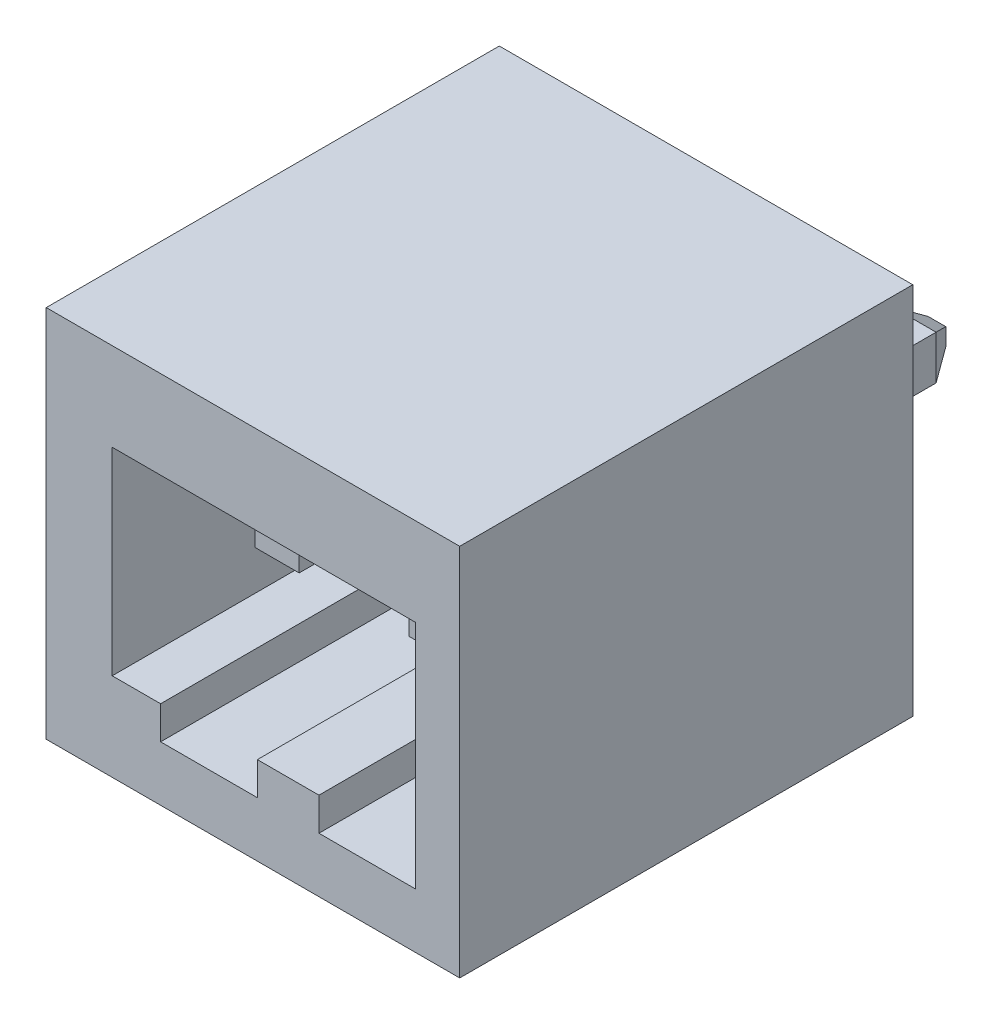
ISO-10303-21;
HEADER;
FILE_DESCRIPTION(('STEP AP214'),'2;1');
FILE_NAME('part.step','',(''),(''),'','','');
FILE_SCHEMA(('AUTOMOTIVE_DESIGN { 1 0 10303 214 1 1 1 1 }'));
ENDSEC;
DATA;
#1=APPLICATION_CONTEXT('core data for automotive mechanical design processes');
#2=APPLICATION_PROTOCOL_DEFINITION('international standard','automotive_design',2000,#1);
#3=PRODUCT_CONTEXT('',#1,'mechanical');
#4=PRODUCT('Part','Part','',(#3));
#5=PRODUCT_RELATED_PRODUCT_CATEGORY('part','',(#4));
#6=PRODUCT_DEFINITION_FORMATION('','',#4);
#7=PRODUCT_DEFINITION_CONTEXT('part definition',#1,'design');
#8=PRODUCT_DEFINITION('design','',#6,#7);
#9=PRODUCT_DEFINITION_SHAPE('','',#8);
#10=(LENGTH_UNIT() NAMED_UNIT(*) SI_UNIT(.MILLI.,.METRE.));
#11=(NAMED_UNIT(*) PLANE_ANGLE_UNIT() SI_UNIT($,.RADIAN.));
#12=(NAMED_UNIT(*) SI_UNIT($,.STERADIAN.) SOLID_ANGLE_UNIT());
#13=UNCERTAINTY_MEASURE_WITH_UNIT(LENGTH_MEASURE(1.E-05),#10,'distance_accuracy_value','');
#14=(GEOMETRIC_REPRESENTATION_CONTEXT(3) GLOBAL_UNCERTAINTY_ASSIGNED_CONTEXT((#13)) GLOBAL_UNIT_ASSIGNED_CONTEXT((#10,
#11,#12)) REPRESENTATION_CONTEXT('',''));
#15=CARTESIAN_POINT('',(0.,0.,0.));
#16=DIRECTION('',(0.,0.,1.));
#17=DIRECTION('',(1.,0.,0.));
#18=AXIS2_PLACEMENT_3D('',#15,#16,#17);
#19=CARTESIAN_POINT('',(4.7,-2.35,10.3));
#20=DIRECTION('',(0.,1.,0.));
#21=DIRECTION('',(-1.,0.,0.));
#22=AXIS2_PLACEMENT_3D('',#19,#20,#21);
#23=PLANE('',#22);
#24=DIRECTION('',(0.,0.,1.));
#25=VECTOR('',#24,1.);
#26=CARTESIAN_POINT('',(0.0999999999999977,-2.35,-0.824327859833893));
#27=LINE('',#26,#25);
#28=CARTESIAN_POINT('',(0.0999999999999977,-2.35,1.5));
#29=VERTEX_POINT('',#28);
#30=CARTESIAN_POINT('',(0.0999999999999977,-2.35,10.3));
#31=VERTEX_POINT('',#30);
#32=EDGE_CURVE('E154',#29,#31,#27,.T.);
#33=ORIENTED_EDGE('',*,*,#32,.T.);
#34=DIRECTION('',(1.,0.,0.));
#35=VECTOR('',#34,1.);
#36=CARTESIAN_POINT('',(0.,-2.35,10.3));
#37=LINE('',#36,#35);
#38=CARTESIAN_POINT('',(1.5,-2.35,10.3));
#39=VERTEX_POINT('',#38);
#40=EDGE_CURVE('E222',#31,#39,#37,.T.);
#41=ORIENTED_EDGE('',*,*,#40,.T.);
#42=DIRECTION('',(0.,0.,1.));
#43=VECTOR('',#42,1.);
#44=CARTESIAN_POINT('',(1.5,-2.35,-0.824327859833893));
#45=LINE('',#44,#43);
#46=CARTESIAN_POINT('',(1.5,-2.35,1.5));
#47=VERTEX_POINT('',#46);
#48=EDGE_CURVE('E198',#47,#39,#45,.T.);
#49=ORIENTED_EDGE('',*,*,#48,.F.);
#50=DIRECTION('',(1.,0.,0.));
#51=VECTOR('',#50,1.);
#52=CARTESIAN_POINT('',(0.,-2.35,1.5));
#53=LINE('',#52,#51);
#54=EDGE_CURVE('E204',#29,#47,#53,.T.);
#55=ORIENTED_EDGE('',*,*,#54,.F.);
#56=EDGE_LOOP('',(#33,#41,#49,#55));
#57=FACE_BOUND('',#56,.T.);
#58=ADVANCED_FACE('F48',(#57),#23,.T.);
#59=CARTESIAN_POINT('',(0.,0.,10.3));
#60=DIRECTION('',(0.,0.,-1.));
#61=DIRECTION('',(-1.,0.,0.));
#62=AXIS2_PLACEMENT_3D('',#59,#60,#61);
#63=PLANE('',#62);
#64=DIRECTION('',(0.,-1.,0.));
#65=VECTOR('',#64,1.);
#66=CARTESIAN_POINT('',(-4.7,4.15,10.3));
#67=LINE('',#66,#65);
#68=CARTESIAN_POINT('',(-4.7,4.15,10.3));
#69=VERTEX_POINT('',#68);
#70=CARTESIAN_POINT('',(-4.7,-4.35,10.3));
#71=VERTEX_POINT('',#70);
#72=EDGE_CURVE('E229',#69,#71,#67,.T.);
#73=ORIENTED_EDGE('',*,*,#72,.T.);
#74=DIRECTION('',(1.,0.,0.));
#75=VECTOR('',#74,1.);
#76=CARTESIAN_POINT('',(4.7,-4.35,10.3));
#77=LINE('',#76,#75);
#78=CARTESIAN_POINT('',(4.7,-4.35,10.3));
#79=VERTEX_POINT('',#78);
#80=EDGE_CURVE('E232',#71,#79,#77,.T.);
#81=ORIENTED_EDGE('',*,*,#80,.T.);
#82=DIRECTION('',(0.,1.,0.));
#83=VECTOR('',#82,1.);
#84=CARTESIAN_POINT('',(4.7,4.15,10.3));
#85=LINE('',#84,#83);
#86=CARTESIAN_POINT('',(4.7,4.15,10.3));
#87=VERTEX_POINT('',#86);
#88=EDGE_CURVE('E235',#79,#87,#85,.T.);
#89=ORIENTED_EDGE('',*,*,#88,.T.);
#90=DIRECTION('',(-1.,0.,0.));
#91=VECTOR('',#90,1.);
#92=CARTESIAN_POINT('',(4.7,4.15,10.3));
#93=LINE('',#92,#91);
#94=EDGE_CURVE('E237',#87,#69,#93,.T.);
#95=ORIENTED_EDGE('',*,*,#94,.T.);
#96=EDGE_LOOP('',(#73,#81,#89,#95));
#97=FACE_BOUND('',#96,.T.);
#98=ORIENTED_EDGE('',*,*,#40,.F.);
#99=DIRECTION('',(0.,1.,0.));
#100=VECTOR('',#99,1.);
#101=CARTESIAN_POINT('',(0.0999999999999977,-2.35,10.3));
#102=LINE('',#101,#100);
#103=CARTESIAN_POINT('',(0.0999999999999978,-3.1,10.3));
#104=VERTEX_POINT('',#103);
#105=EDGE_CURVE('E170',#104,#31,#102,.T.);
#106=ORIENTED_EDGE('',*,*,#105,.F.);
#107=DIRECTION('',(1.,0.,0.));
#108=VECTOR('',#107,1.);
#109=CARTESIAN_POINT('',(-2.1,-3.1,10.3));
#110=LINE('',#109,#108);
#111=CARTESIAN_POINT('',(-2.1,-3.1,10.3));
#112=VERTEX_POINT('',#111);
#113=EDGE_CURVE('E162',#112,#104,#110,.T.);
#114=ORIENTED_EDGE('',*,*,#113,.F.);
#115=DIRECTION('',(0.,-1.,0.));
#116=VECTOR('',#115,1.);
#117=CARTESIAN_POINT('',(-2.1,-2.35,10.3));
#118=LINE('',#117,#116);
#119=CARTESIAN_POINT('',(-2.1,-2.35,10.3));
#120=VERTEX_POINT('',#119);
#121=EDGE_CURVE('E175',#120,#112,#118,.T.);
#122=ORIENTED_EDGE('',*,*,#121,.F.);
#123=CARTESIAN_POINT('',(-3.2,-2.35,10.3));
#124=VERTEX_POINT('',#123);
#125=EDGE_CURVE('E223',#124,#120,#37,.T.);
#126=ORIENTED_EDGE('',*,*,#125,.F.);
#127=DIRECTION('',(0.,-1.,0.));
#128=VECTOR('',#127,1.);
#129=CARTESIAN_POINT('',(-3.2,0.,10.3));
#130=LINE('',#129,#128);
#131=CARTESIAN_POINT('',(-3.2,2.15,10.3));
#132=VERTEX_POINT('',#131);
#133=EDGE_CURVE('E220',#132,#124,#130,.T.);
#134=ORIENTED_EDGE('',*,*,#133,.F.);
#135=DIRECTION('',(-1.,0.,0.));
#136=VECTOR('',#135,1.);
#137=CARTESIAN_POINT('',(0.,2.15,10.3));
#138=LINE('',#137,#136);
#139=CARTESIAN_POINT('',(3.7,2.15,10.3));
#140=VERTEX_POINT('',#139);
#141=EDGE_CURVE('E212',#140,#132,#138,.T.);
#142=ORIENTED_EDGE('',*,*,#141,.F.);
#143=DIRECTION('',(0.,1.,0.));
#144=VECTOR('',#143,1.);
#145=CARTESIAN_POINT('',(3.7,0.,10.3));
#146=LINE('',#145,#144);
#147=CARTESIAN_POINT('',(3.7,-3.1,10.3));
#148=VERTEX_POINT('',#147);
#149=EDGE_CURVE('E226',#148,#140,#146,.T.);
#150=ORIENTED_EDGE('',*,*,#149,.F.);
#151=DIRECTION('',(1.,0.,0.));
#152=VECTOR('',#151,1.);
#153=CARTESIAN_POINT('',(1.5,-3.1,10.3));
#154=LINE('',#153,#152);
#155=CARTESIAN_POINT('',(1.5,-3.1,10.3));
#156=VERTEX_POINT('',#155);
#157=EDGE_CURVE('E184',#156,#148,#154,.T.);
#158=ORIENTED_EDGE('',*,*,#157,.F.);
#159=DIRECTION('',(0.,-1.,0.));
#160=VECTOR('',#159,1.);
#161=CARTESIAN_POINT('',(1.5,-2.35,10.3));
#162=LINE('',#161,#160);
#163=EDGE_CURVE('E188',#39,#156,#162,.T.);
#164=ORIENTED_EDGE('',*,*,#163,.F.);
#165=EDGE_LOOP('',(#98,#106,#114,#122,#126,#134,#142,#150,#158,#164));
#166=FACE_BOUND('',#165,.T.);
#167=ADVANCED_FACE('F271',(#97,#166),#63,.F.);
#168=CARTESIAN_POINT('',(-4.7,4.15,10.3));
#169=DIRECTION('',(1.,0.,0.));
#170=DIRECTION('',(0.,0.,-1.));
#171=AXIS2_PLACEMENT_3D('',#168,#169,#170);
#172=PLANE('',#171);
#173=DIRECTION('',(0.,-1.,0.));
#174=VECTOR('',#173,1.);
#175=CARTESIAN_POINT('',(-4.7,4.15,0.));
#176=LINE('',#175,#174);
#177=CARTESIAN_POINT('',(-4.7,4.15,0.));
#178=VERTEX_POINT('',#177);
#179=CARTESIAN_POINT('',(-4.7,-4.35,0.));
#180=VERTEX_POINT('',#179);
#181=EDGE_CURVE('E208',#178,#180,#176,.T.);
#182=ORIENTED_EDGE('',*,*,#181,.T.);
#183=DIRECTION('',(0.,0.,-1.));
#184=VECTOR('',#183,1.);
#185=CARTESIAN_POINT('',(-4.7,-4.35,10.3));
#186=LINE('',#185,#184);
#187=EDGE_CURVE('E12',#71,#180,#186,.T.);
#188=ORIENTED_EDGE('',*,*,#187,.F.);
#189=ORIENTED_EDGE('',*,*,#72,.F.);
#190=DIRECTION('',(0.,0.,-1.));
#191=VECTOR('',#190,1.);
#192=CARTESIAN_POINT('',(-4.7,4.15,10.3));
#193=LINE('',#192,#191);
#194=EDGE_CURVE('E239',#69,#178,#193,.T.);
#195=ORIENTED_EDGE('',*,*,#194,.T.);
#196=EDGE_LOOP('',(#182,#188,#189,#195));
#197=FACE_BOUND('',#196,.T.);
#198=ADVANCED_FACE('F50',(#197),#172,.F.);
#199=CARTESIAN_POINT('',(4.7,-4.35,10.3));
#200=DIRECTION('',(0.,1.,0.));
#201=DIRECTION('',(-1.,0.,0.));
#202=AXIS2_PLACEMENT_3D('',#199,#200,#201);
#203=PLANE('',#202);
#204=DIRECTION('',(1.,0.,0.));
#205=VECTOR('',#204,1.);
#206=CARTESIAN_POINT('',(4.7,-4.35,0.));
#207=LINE('',#206,#205);
#208=CARTESIAN_POINT('',(4.7,-4.35,0.));
#209=VERTEX_POINT('',#208);
#210=EDGE_CURVE('E242',#180,#209,#207,.T.);
#211=ORIENTED_EDGE('',*,*,#210,.T.);
#212=DIRECTION('',(0.,0.,-1.));
#213=VECTOR('',#212,1.);
#214=CARTESIAN_POINT('',(4.7,-4.35,10.3));
#215=LINE('',#214,#213);
#216=EDGE_CURVE('E56',#79,#209,#215,.T.);
#217=ORIENTED_EDGE('',*,*,#216,.F.);
#218=ORIENTED_EDGE('',*,*,#80,.F.);
#219=ORIENTED_EDGE('',*,*,#187,.T.);
#220=EDGE_LOOP('',(#211,#217,#218,#219));
#221=FACE_BOUND('',#220,.T.);
#222=ADVANCED_FACE('F273',(#221),#203,.F.);
#223=CARTESIAN_POINT('',(4.7,4.15,10.3));
#224=DIRECTION('',(-1.,0.,0.));
#225=DIRECTION('',(0.,-1.,0.));
#226=AXIS2_PLACEMENT_3D('',#223,#224,#225);
#227=PLANE('',#226);
#228=DIRECTION('',(0.,1.,0.));
#229=VECTOR('',#228,1.);
#230=CARTESIAN_POINT('',(4.7,4.15,0.));
#231=LINE('',#230,#229);
#232=CARTESIAN_POINT('',(4.7,4.15,0.));
#233=VERTEX_POINT('',#232);
#234=EDGE_CURVE('E244',#209,#233,#231,.T.);
#235=ORIENTED_EDGE('',*,*,#234,.T.);
#236=DIRECTION('',(0.,0.,-1.));
#237=VECTOR('',#236,1.);
#238=CARTESIAN_POINT('',(4.7,4.15,10.3));
#239=LINE('',#238,#237);
#240=EDGE_CURVE('E249',#87,#233,#239,.T.);
#241=ORIENTED_EDGE('',*,*,#240,.F.);
#242=ORIENTED_EDGE('',*,*,#88,.F.);
#243=ORIENTED_EDGE('',*,*,#216,.T.);
#244=EDGE_LOOP('',(#235,#241,#242,#243));
#245=FACE_BOUND('',#244,.T.);
#246=ADVANCED_FACE('F256',(#245),#227,.F.);
#247=CARTESIAN_POINT('',(4.7,4.15,10.3));
#248=DIRECTION('',(0.,-1.,0.));
#249=DIRECTION('',(1.,0.,0.));
#250=AXIS2_PLACEMENT_3D('',#247,#248,#249);
#251=PLANE('',#250);
#252=DIRECTION('',(-1.,0.,0.));
#253=VECTOR('',#252,1.);
#254=CARTESIAN_POINT('',(4.7,4.15,0.));
#255=LINE('',#254,#253);
#256=EDGE_CURVE('E233',#233,#178,#255,.T.);
#257=ORIENTED_EDGE('',*,*,#256,.T.);
#258=ORIENTED_EDGE('',*,*,#194,.F.);
#259=ORIENTED_EDGE('',*,*,#94,.F.);
#260=ORIENTED_EDGE('',*,*,#240,.T.);
#261=EDGE_LOOP('',(#257,#258,#259,#260));
#262=FACE_BOUND('',#261,.T.);
#263=ADVANCED_FACE('F265',(#262),#251,.F.);
#264=CARTESIAN_POINT('',(0.,0.,0.));
#265=DIRECTION('',(0.,0.,-1.));
#266=DIRECTION('',(-1.,0.,0.));
#267=AXIS2_PLACEMENT_3D('',#264,#265,#266);
#268=PLANE('',#267);
#269=ORIENTED_EDGE('',*,*,#181,.F.);
#270=ORIENTED_EDGE('',*,*,#256,.F.);
#271=ORIENTED_EDGE('',*,*,#234,.F.);
#272=ORIENTED_EDGE('',*,*,#210,.F.);
#273=EDGE_LOOP('',(#269,#270,#271,#272));
#274=FACE_BOUND('',#273,.T.);
#275=ADVANCED_FACE('F262',(#274),#268,.T.);
#276=CARTESIAN_POINT('',(-3.2,4.15,10.3));
#277=DIRECTION('',(1.,0.,0.));
#278=DIRECTION('',(0.,0.,-1.));
#279=AXIS2_PLACEMENT_3D('',#276,#277,#278);
#280=PLANE('',#279);
#281=DIRECTION('',(0.,-1.,0.));
#282=VECTOR('',#281,1.);
#283=CARTESIAN_POINT('',(-3.2,0.,1.5));
#284=LINE('',#283,#282);
#285=CARTESIAN_POINT('',(-3.2,2.15,1.5));
#286=VERTEX_POINT('',#285);
#287=CARTESIAN_POINT('',(-3.2,-2.35,1.5));
#288=VERTEX_POINT('',#287);
#289=EDGE_CURVE('E183',#286,#288,#284,.T.);
#290=ORIENTED_EDGE('',*,*,#289,.F.);
#291=DIRECTION('',(0.,0.,-1.));
#292=VECTOR('',#291,1.);
#293=CARTESIAN_POINT('',(-3.2,2.15,10.3));
#294=LINE('',#293,#292);
#295=EDGE_CURVE('E209',#132,#286,#294,.T.);
#296=ORIENTED_EDGE('',*,*,#295,.F.);
#297=ORIENTED_EDGE('',*,*,#133,.T.);
#298=DIRECTION('',(0.,0.,-1.));
#299=VECTOR('',#298,1.);
#300=CARTESIAN_POINT('',(-3.2,-2.35,10.3));
#301=LINE('',#300,#299);
#302=EDGE_CURVE('E205',#124,#288,#301,.T.);
#303=ORIENTED_EDGE('',*,*,#302,.T.);
#304=EDGE_LOOP('',(#290,#296,#297,#303));
#305=FACE_BOUND('',#304,.T.);
#306=ADVANCED_FACE('F292',(#305),#280,.T.);
#307=DIRECTION('',(0.,0.,1.));
#308=VECTOR('',#307,1.);
#309=CARTESIAN_POINT('',(-2.1,-2.35,-0.824327859833893));
#310=LINE('',#309,#308);
#311=CARTESIAN_POINT('',(-2.1,-2.35,1.5));
#312=VERTEX_POINT('',#311);
#313=EDGE_CURVE('E178',#312,#120,#310,.T.);
#314=ORIENTED_EDGE('',*,*,#313,.F.);
#315=EDGE_CURVE('E213',#288,#312,#53,.T.);
#316=ORIENTED_EDGE('',*,*,#315,.F.);
#317=ORIENTED_EDGE('',*,*,#302,.F.);
#318=ORIENTED_EDGE('',*,*,#125,.T.);
#319=EDGE_LOOP('',(#314,#316,#317,#318));
#320=FACE_BOUND('',#319,.T.);
#321=ADVANCED_FACE('F283',(#320),#23,.T.);
#322=CARTESIAN_POINT('',(3.7,4.15,10.3));
#323=DIRECTION('',(-1.,0.,0.));
#324=DIRECTION('',(0.,-1.,0.));
#325=AXIS2_PLACEMENT_3D('',#322,#323,#324);
#326=PLANE('',#325);
#327=DIRECTION('',(0.,1.,0.));
#328=VECTOR('',#327,1.);
#329=CARTESIAN_POINT('',(3.7,0.,1.5));
#330=LINE('',#329,#328);
#331=CARTESIAN_POINT('',(3.7,-3.1,1.5));
#332=VERTEX_POINT('',#331);
#333=CARTESIAN_POINT('',(3.7,2.15,1.5));
#334=VERTEX_POINT('',#333);
#335=EDGE_CURVE('E215',#332,#334,#330,.T.);
#336=ORIENTED_EDGE('',*,*,#335,.F.);
#337=DIRECTION('',(0.,0.,1.));
#338=VECTOR('',#337,1.);
#339=CARTESIAN_POINT('',(3.7,-3.1,-0.824327859833893));
#340=LINE('',#339,#338);
#341=EDGE_CURVE('E193',#332,#148,#340,.T.);
#342=ORIENTED_EDGE('',*,*,#341,.T.);
#343=ORIENTED_EDGE('',*,*,#149,.T.);
#344=DIRECTION('',(0.,0.,-1.));
#345=VECTOR('',#344,1.);
#346=CARTESIAN_POINT('',(3.7,2.15,10.3));
#347=LINE('',#346,#345);
#348=EDGE_CURVE('E71',#140,#334,#347,.T.);
#349=ORIENTED_EDGE('',*,*,#348,.T.);
#350=EDGE_LOOP('',(#336,#342,#343,#349));
#351=FACE_BOUND('',#350,.T.);
#352=ADVANCED_FACE('F291',(#351),#326,.T.);
#353=CARTESIAN_POINT('',(4.7,2.15,10.3));
#354=DIRECTION('',(0.,-1.,0.));
#355=DIRECTION('',(1.,0.,0.));
#356=AXIS2_PLACEMENT_3D('',#353,#354,#355);
#357=PLANE('',#356);
#358=DIRECTION('',(-1.,0.,0.));
#359=VECTOR('',#358,1.);
#360=CARTESIAN_POINT('',(0.,2.15,1.5));
#361=LINE('',#360,#359);
#362=EDGE_CURVE('E217',#334,#286,#361,.T.);
#363=ORIENTED_EDGE('',*,*,#362,.F.);
#364=ORIENTED_EDGE('',*,*,#348,.F.);
#365=ORIENTED_EDGE('',*,*,#141,.T.);
#366=ORIENTED_EDGE('',*,*,#295,.T.);
#367=EDGE_LOOP('',(#363,#364,#365,#366));
#368=FACE_BOUND('',#367,.T.);
#369=ADVANCED_FACE('F298',(#368),#357,.T.);
#370=CARTESIAN_POINT('',(0.,0.,1.5));
#371=DIRECTION('',(0.,0.,-1.));
#372=DIRECTION('',(-1.,0.,0.));
#373=AXIS2_PLACEMENT_3D('',#370,#371,#372);
#374=PLANE('',#373);
#375=ORIENTED_EDGE('',*,*,#289,.T.);
#376=ORIENTED_EDGE('',*,*,#315,.T.);
#377=DIRECTION('',(0.,-1.,0.));
#378=VECTOR('',#377,1.);
#379=CARTESIAN_POINT('',(-2.1,-2.35,1.5));
#380=LINE('',#379,#378);
#381=CARTESIAN_POINT('',(-2.1,-3.1,1.5));
#382=VERTEX_POINT('',#381);
#383=EDGE_CURVE('E168',#312,#382,#380,.T.);
#384=ORIENTED_EDGE('',*,*,#383,.T.);
#385=DIRECTION('',(1.,0.,0.));
#386=VECTOR('',#385,1.);
#387=CARTESIAN_POINT('',(-2.1,-3.1,1.5));
#388=LINE('',#387,#386);
#389=CARTESIAN_POINT('',(0.0999999999999978,-3.1,1.5));
#390=VERTEX_POINT('',#389);
#391=EDGE_CURVE('E159',#382,#390,#388,.T.);
#392=ORIENTED_EDGE('',*,*,#391,.T.);
#393=DIRECTION('',(0.,1.,0.));
#394=VECTOR('',#393,1.);
#395=CARTESIAN_POINT('',(0.0999999999999977,-2.35,1.5));
#396=LINE('',#395,#394);
#397=EDGE_CURVE('E63',#390,#29,#396,.T.);
#398=ORIENTED_EDGE('',*,*,#397,.T.);
#399=ORIENTED_EDGE('',*,*,#54,.T.);
#400=DIRECTION('',(0.,-1.,0.));
#401=VECTOR('',#400,1.);
#402=CARTESIAN_POINT('',(1.5,-2.35,1.5));
#403=LINE('',#402,#401);
#404=CARTESIAN_POINT('',(1.5,-3.1,1.5));
#405=VERTEX_POINT('',#404);
#406=EDGE_CURVE('E194',#47,#405,#403,.T.);
#407=ORIENTED_EDGE('',*,*,#406,.T.);
#408=DIRECTION('',(1.,0.,0.));
#409=VECTOR('',#408,1.);
#410=CARTESIAN_POINT('',(1.5,-3.1,1.5));
#411=LINE('',#410,#409);
#412=EDGE_CURVE('E187',#405,#332,#411,.T.);
#413=ORIENTED_EDGE('',*,*,#412,.T.);
#414=ORIENTED_EDGE('',*,*,#335,.T.);
#415=ORIENTED_EDGE('',*,*,#362,.T.);
#416=EDGE_LOOP('',(#375,#376,#384,#392,#398,#399,#407,#413,#414,#415));
#417=FACE_BOUND('',#416,.T.);
#418=ADVANCED_FACE('F166',(#417),#374,.F.);
#419=CARTESIAN_POINT('',(1.5,-3.1,-0.824327859833893));
#420=DIRECTION('',(0.,-1.,0.));
#421=DIRECTION('',(1.,0.,0.));
#422=AXIS2_PLACEMENT_3D('',#419,#420,#421);
#423=PLANE('',#422);
#424=DIRECTION('',(0.,0.,1.));
#425=VECTOR('',#424,1.);
#426=CARTESIAN_POINT('',(1.5,-3.1,-0.824327859833893));
#427=LINE('',#426,#425);
#428=EDGE_CURVE('E197',#405,#156,#427,.T.);
#429=ORIENTED_EDGE('',*,*,#428,.T.);
#430=ORIENTED_EDGE('',*,*,#157,.T.);
#431=ORIENTED_EDGE('',*,*,#341,.F.);
#432=ORIENTED_EDGE('',*,*,#412,.F.);
#433=EDGE_LOOP('',(#429,#430,#431,#432));
#434=FACE_BOUND('',#433,.T.);
#435=ADVANCED_FACE('F325',(#434),#423,.F.);
#436=CARTESIAN_POINT('',(1.5,-2.35,-0.824327859833893));
#437=DIRECTION('',(-1.,0.,0.));
#438=DIRECTION('',(0.,-1.,0.));
#439=AXIS2_PLACEMENT_3D('',#436,#437,#438);
#440=PLANE('',#439);
#441=ORIENTED_EDGE('',*,*,#48,.T.);
#442=ORIENTED_EDGE('',*,*,#163,.T.);
#443=ORIENTED_EDGE('',*,*,#428,.F.);
#444=ORIENTED_EDGE('',*,*,#406,.F.);
#445=EDGE_LOOP('',(#441,#442,#443,#444));
#446=FACE_BOUND('',#445,.T.);
#447=ADVANCED_FACE('F322',(#446),#440,.F.);
#448=CARTESIAN_POINT('',(-2.1,-3.1,-0.824327859833893));
#449=DIRECTION('',(0.,-1.,0.));
#450=DIRECTION('',(0.,0.,-1.));
#451=AXIS2_PLACEMENT_3D('',#448,#449,#450);
#452=PLANE('',#451);
#453=DIRECTION('',(0.,0.,1.));
#454=VECTOR('',#453,1.);
#455=CARTESIAN_POINT('',(-2.1,-3.1,-0.824327859833893));
#456=LINE('',#455,#454);
#457=EDGE_CURVE('E177',#382,#112,#456,.T.);
#458=ORIENTED_EDGE('',*,*,#457,.T.);
#459=ORIENTED_EDGE('',*,*,#113,.T.);
#460=DIRECTION('',(0.,0.,1.));
#461=VECTOR('',#460,1.);
#462=CARTESIAN_POINT('',(0.0999999999999978,-3.1,-0.824327859833893));
#463=LINE('',#462,#461);
#464=EDGE_CURVE('E151',#390,#104,#463,.T.);
#465=ORIENTED_EDGE('',*,*,#464,.F.);
#466=ORIENTED_EDGE('',*,*,#391,.F.);
#467=EDGE_LOOP('',(#458,#459,#465,#466));
#468=FACE_BOUND('',#467,.T.);
#469=ADVANCED_FACE('F158',(#468),#452,.F.);
#470=CARTESIAN_POINT('',(0.0999999999999977,-2.35,-0.824327859833893));
#471=DIRECTION('',(1.,0.,0.));
#472=DIRECTION('',(0.,1.,0.));
#473=AXIS2_PLACEMENT_3D('',#470,#471,#472);
#474=PLANE('',#473);
#475=ORIENTED_EDGE('',*,*,#464,.T.);
#476=ORIENTED_EDGE('',*,*,#105,.T.);
#477=ORIENTED_EDGE('',*,*,#32,.F.);
#478=ORIENTED_EDGE('',*,*,#397,.F.);
#479=EDGE_LOOP('',(#475,#476,#477,#478));
#480=FACE_BOUND('',#479,.T.);
#481=ADVANCED_FACE('F150',(#480),#474,.F.);
#482=CARTESIAN_POINT('',(-2.1,-2.35,-0.824327859833893));
#483=DIRECTION('',(-1.,0.,0.));
#484=DIRECTION('',(0.,-1.,0.));
#485=AXIS2_PLACEMENT_3D('',#482,#483,#484);
#486=PLANE('',#485);
#487=ORIENTED_EDGE('',*,*,#313,.T.);
#488=ORIENTED_EDGE('',*,*,#121,.T.);
#489=ORIENTED_EDGE('',*,*,#457,.F.);
#490=ORIENTED_EDGE('',*,*,#383,.F.);
#491=EDGE_LOOP('',(#487,#488,#489,#490));
#492=FACE_BOUND('',#491,.T.);
#493=ADVANCED_FACE('F312',(#492),#486,.F.);
#494=CLOSED_SHELL('',(#58,#167,#198,#222,#246,#263,#275,#306,#321,#352,#369,#418,#435,#447,#469,
#481,#493));
#495=MANIFOLD_SOLID_BREP('B2',#494);
#496=CARTESIAN_POINT('',(2.25,-0.5,-3.5));
#497=DIRECTION('',(1.,0.,0.));
#498=DIRECTION('',(0.,0.,-1.));
#499=AXIS2_PLACEMENT_3D('',#496,#497,#498);
#500=PLANE('',#499);
#501=DIRECTION('',(0.,0.,1.));
#502=VECTOR('',#501,1.);
#503=CARTESIAN_POINT('',(2.25,-0.5,-3.5));
#504=LINE('',#503,#502);
#505=CARTESIAN_POINT('',(2.25,-0.5,-2.98038475772934));
#506=VERTEX_POINT('',#505);
#507=CARTESIAN_POINT('',(2.25,-0.5,8.));
#508=VERTEX_POINT('',#507);
#509=EDGE_CURVE('E530',#506,#508,#504,.T.);
#510=ORIENTED_EDGE('',*,*,#509,.F.);
#511=DIRECTION('',(0.,1.,0.));
#512=VECTOR('',#511,1.);
#513=CARTESIAN_POINT('',(2.25,-0.5,-2.98038475772934));
#514=LINE('',#513,#512);
#515=CARTESIAN_POINT('',(2.25,0.5,-2.98038475772934));
#516=VERTEX_POINT('',#515);
#517=EDGE_CURVE('E46',#506,#516,#514,.T.);
#518=ORIENTED_EDGE('',*,*,#517,.T.);
#519=DIRECTION('',(0.,0.,1.));
#520=VECTOR('',#519,1.);
#521=CARTESIAN_POINT('',(2.25,0.5,-3.5));
#522=LINE('',#521,#520);
#523=CARTESIAN_POINT('',(2.25,0.5,8.));
#524=VERTEX_POINT('',#523);
#525=EDGE_CURVE('E506',#516,#524,#522,.T.);
#526=ORIENTED_EDGE('',*,*,#525,.T.);
#527=DIRECTION('',(0.,1.,0.));
#528=VECTOR('',#527,1.);
#529=CARTESIAN_POINT('',(2.25,-0.5,8.));
#530=LINE('',#529,#528);
#531=EDGE_CURVE('E509',#508,#524,#530,.T.);
#532=ORIENTED_EDGE('',*,*,#531,.F.);
#533=EDGE_LOOP('',(#510,#518,#526,#532));
#534=FACE_BOUND('',#533,.T.);
#535=ADVANCED_FACE('F455',(#534),#500,.T.);
#536=CARTESIAN_POINT('',(1.25,-0.5,-3.5));
#537=DIRECTION('',(0.,-1.,0.));
#538=DIRECTION('',(0.,0.,-1.));
#539=AXIS2_PLACEMENT_3D('',#536,#537,#538);
#540=PLANE('',#539);
#541=DIRECTION('',(0.,0.,1.));
#542=VECTOR('',#541,1.);
#543=CARTESIAN_POINT('',(1.25,-0.5,-3.5));
#544=LINE('',#543,#542);
#545=CARTESIAN_POINT('',(1.25,-0.5,-2.98038475772934));
#546=VERTEX_POINT('',#545);
#547=CARTESIAN_POINT('',(1.25,-0.5,8.));
#548=VERTEX_POINT('',#547);
#549=EDGE_CURVE('E533',#546,#548,#544,.T.);
#550=ORIENTED_EDGE('',*,*,#549,.F.);
#551=DIRECTION('',(1.,0.,0.));
#552=VECTOR('',#551,1.);
#553=CARTESIAN_POINT('',(1.25,-0.5,-2.98038475772934));
#554=LINE('',#553,#552);
#555=EDGE_CURVE('E532',#546,#506,#554,.T.);
#556=ORIENTED_EDGE('',*,*,#555,.T.);
#557=ORIENTED_EDGE('',*,*,#509,.T.);
#558=DIRECTION('',(1.,0.,0.));
#559=VECTOR('',#558,1.);
#560=CARTESIAN_POINT('',(1.25,-0.5,8.));
#561=LINE('',#560,#559);
#562=EDGE_CURVE('E511',#548,#508,#561,.T.);
#563=ORIENTED_EDGE('',*,*,#562,.F.);
#564=EDGE_LOOP('',(#550,#556,#557,#563));
#565=FACE_BOUND('',#564,.T.);
#566=ADVANCED_FACE('F572',(#565),#540,.T.);
#567=CARTESIAN_POINT('',(1.25,-0.5,-3.5));
#568=DIRECTION('',(-1.,0.,0.));
#569=DIRECTION('',(0.,0.,1.));
#570=AXIS2_PLACEMENT_3D('',#567,#568,#569);
#571=PLANE('',#570);
#572=DIRECTION('',(0.,0.,1.));
#573=VECTOR('',#572,1.);
#574=CARTESIAN_POINT('',(1.25,0.5,-3.5));
#575=LINE('',#574,#573);
#576=CARTESIAN_POINT('',(1.25,0.5,-2.98038475772934));
#577=VERTEX_POINT('',#576);
#578=CARTESIAN_POINT('',(1.25,0.5,8.));
#579=VERTEX_POINT('',#578);
#580=EDGE_CURVE('E510',#577,#579,#575,.T.);
#581=ORIENTED_EDGE('',*,*,#580,.F.);
#582=DIRECTION('',(0.,-1.,0.));
#583=VECTOR('',#582,1.);
#584=CARTESIAN_POINT('',(1.25,-0.5,-2.98038475772934));
#585=LINE('',#584,#583);
#586=EDGE_CURVE('E547',#577,#546,#585,.T.);
#587=ORIENTED_EDGE('',*,*,#586,.T.);
#588=ORIENTED_EDGE('',*,*,#549,.T.);
#589=DIRECTION('',(0.,-1.,0.));
#590=VECTOR('',#589,1.);
#591=CARTESIAN_POINT('',(1.25,-0.5,8.));
#592=LINE('',#591,#590);
#593=EDGE_CURVE('E519',#579,#548,#592,.T.);
#594=ORIENTED_EDGE('',*,*,#593,.F.);
#595=EDGE_LOOP('',(#581,#587,#588,#594));
#596=FACE_BOUND('',#595,.T.);
#597=ADVANCED_FACE('F570',(#596),#571,.T.);
#598=CARTESIAN_POINT('',(1.25,0.5,-3.5));
#599=DIRECTION('',(0.,1.,0.));
#600=DIRECTION('',(0.,0.,1.));
#601=AXIS2_PLACEMENT_3D('',#598,#599,#600);
#602=PLANE('',#601);
#603=ORIENTED_EDGE('',*,*,#525,.F.);
#604=DIRECTION('',(-1.,0.,0.));
#605=VECTOR('',#604,1.);
#606=CARTESIAN_POINT('',(1.25,0.5,-2.98038475772934));
#607=LINE('',#606,#605);
#608=EDGE_CURVE('E464',#516,#577,#607,.T.);
#609=ORIENTED_EDGE('',*,*,#608,.T.);
#610=ORIENTED_EDGE('',*,*,#580,.T.);
#611=DIRECTION('',(-1.,0.,0.));
#612=VECTOR('',#611,1.);
#613=CARTESIAN_POINT('',(1.25,0.5,8.));
#614=LINE('',#613,#612);
#615=EDGE_CURVE('E514',#524,#579,#614,.T.);
#616=ORIENTED_EDGE('',*,*,#615,.F.);
#617=EDGE_LOOP('',(#603,#609,#610,#616));
#618=FACE_BOUND('',#617,.T.);
#619=ADVANCED_FACE('F515',(#618),#602,.T.);
#620=CARTESIAN_POINT('',(3.5,0.,-3.5));
#621=DIRECTION('',(0.,0.,-1.));
#622=DIRECTION('',(-1.,0.,0.));
#623=AXIS2_PLACEMENT_3D('',#620,#621,#622);
#624=PLANE('',#623);
#625=DIRECTION('',(0.,-1.,0.));
#626=VECTOR('',#625,1.);
#627=CARTESIAN_POINT('',(1.95,0.,-3.5));
#628=LINE('',#627,#626);
#629=CARTESIAN_POINT('',(1.95,0.2,-3.5));
#630=VERTEX_POINT('',#629);
#631=CARTESIAN_POINT('',(1.95,-0.2,-3.5));
#632=VERTEX_POINT('',#631);
#633=EDGE_CURVE('E538',#630,#632,#628,.T.);
#634=ORIENTED_EDGE('',*,*,#633,.T.);
#635=DIRECTION('',(-1.,0.,0.));
#636=VECTOR('',#635,1.);
#637=CARTESIAN_POINT('',(3.5,-0.2,-3.5));
#638=LINE('',#637,#636);
#639=CARTESIAN_POINT('',(1.55,-0.2,-3.5));
#640=VERTEX_POINT('',#639);
#641=EDGE_CURVE('E544',#632,#640,#638,.T.);
#642=ORIENTED_EDGE('',*,*,#641,.T.);
#643=DIRECTION('',(0.,1.,0.));
#644=VECTOR('',#643,1.);
#645=CARTESIAN_POINT('',(1.55,0.,-3.5));
#646=LINE('',#645,#644);
#647=CARTESIAN_POINT('',(1.55,0.2,-3.5));
#648=VERTEX_POINT('',#647);
#649=EDGE_CURVE('E542',#640,#648,#646,.T.);
#650=ORIENTED_EDGE('',*,*,#649,.T.);
#651=DIRECTION('',(1.,0.,0.));
#652=VECTOR('',#651,1.);
#653=CARTESIAN_POINT('',(3.5,0.2,-3.5));
#654=LINE('',#653,#652);
#655=EDGE_CURVE('E540',#648,#630,#654,.T.);
#656=ORIENTED_EDGE('',*,*,#655,.T.);
#657=EDGE_LOOP('',(#634,#642,#650,#656));
#658=FACE_BOUND('',#657,.T.);
#659=ADVANCED_FACE('F577',(#658),#624,.T.);
#660=CARTESIAN_POINT('',(3.5,0.,8.));
#661=DIRECTION('',(0.,0.,-1.));
#662=DIRECTION('',(-1.,0.,0.));
#663=AXIS2_PLACEMENT_3D('',#660,#661,#662);
#664=PLANE('',#663);
#665=ORIENTED_EDGE('',*,*,#531,.T.);
#666=ORIENTED_EDGE('',*,*,#615,.T.);
#667=ORIENTED_EDGE('',*,*,#593,.T.);
#668=ORIENTED_EDGE('',*,*,#562,.T.);
#669=EDGE_LOOP('',(#665,#666,#667,#668));
#670=FACE_BOUND('',#669,.T.);
#671=ADVANCED_FACE('F522',(#670),#664,.F.);
#672=CARTESIAN_POINT('',(1.25,0.5,-2.98038475772934));
#673=DIRECTION('',(0.,-0.866025403784438,0.500000000000001));
#674=DIRECTION('',(-1.,0.,0.));
#675=AXIS2_PLACEMENT_3D('',#672,#673,#674);
#676=PLANE('',#675);
#677=DIRECTION('',(0.447213595499959,0.447213595499959,0.774596669241482));
#678=VECTOR('',#677,1.);
#679=CARTESIAN_POINT('',(2.05,0.299999999999999,-3.32679491924311));
#680=LINE('',#679,#678);
#681=EDGE_CURVE('E526',#630,#516,#680,.T.);
#682=ORIENTED_EDGE('',*,*,#681,.F.);
#683=ORIENTED_EDGE('',*,*,#655,.F.);
#684=DIRECTION('',(-0.447213595499959,0.447213595499959,0.774596669241482));
#685=VECTOR('',#684,1.);
#686=CARTESIAN_POINT('',(1.25,0.5,-2.98038475772934));
#687=LINE('',#686,#685);
#688=EDGE_CURVE('E459',#577,#648,#687,.F.);
#689=ORIENTED_EDGE('',*,*,#688,.F.);
#690=ORIENTED_EDGE('',*,*,#608,.F.);
#691=EDGE_LOOP('',(#682,#683,#689,#690));
#692=FACE_BOUND('',#691,.T.);
#693=ADVANCED_FACE('F457',(#692),#676,.F.);
#694=CARTESIAN_POINT('',(1.25,-0.5,-2.98038475772934));
#695=DIRECTION('',(0.866025403784438,0.,0.500000000000001));
#696=DIRECTION('',(0.,-1.,0.));
#697=AXIS2_PLACEMENT_3D('',#694,#695,#696);
#698=PLANE('',#697);
#699=ORIENTED_EDGE('',*,*,#688,.T.);
#700=ORIENTED_EDGE('',*,*,#649,.F.);
#701=DIRECTION('',(-0.447213595499959,-0.447213595499959,0.774596669241482));
#702=VECTOR('',#701,1.);
#703=CARTESIAN_POINT('',(1.25,-0.5,-2.98038475772934));
#704=LINE('',#703,#702);
#705=EDGE_CURVE('E552',#546,#640,#704,.F.);
#706=ORIENTED_EDGE('',*,*,#705,.F.);
#707=ORIENTED_EDGE('',*,*,#586,.F.);
#708=EDGE_LOOP('',(#699,#700,#706,#707));
#709=FACE_BOUND('',#708,.T.);
#710=ADVANCED_FACE('F566',(#709),#698,.F.);
#711=CARTESIAN_POINT('',(2.25,-0.5,-2.98038475772934));
#712=DIRECTION('',(-0.866025403784438,0.,0.500000000000001));
#713=DIRECTION('',(0.,1.,0.));
#714=AXIS2_PLACEMENT_3D('',#711,#712,#713);
#715=PLANE('',#714);
#716=ORIENTED_EDGE('',*,*,#681,.T.);
#717=ORIENTED_EDGE('',*,*,#517,.F.);
#718=DIRECTION('',(-0.447213595499959,0.447213595499959,-0.774596669241482));
#719=VECTOR('',#718,1.);
#720=CARTESIAN_POINT('',(2.25,-0.5,-2.98038475772934));
#721=LINE('',#720,#719);
#722=EDGE_CURVE('E550',#632,#506,#721,.F.);
#723=ORIENTED_EDGE('',*,*,#722,.F.);
#724=ORIENTED_EDGE('',*,*,#633,.F.);
#725=EDGE_LOOP('',(#716,#717,#723,#724));
#726=FACE_BOUND('',#725,.T.);
#727=ADVANCED_FACE('F557',(#726),#715,.F.);
#728=CARTESIAN_POINT('',(1.25,-0.5,-2.98038475772934));
#729=DIRECTION('',(0.,0.866025403784438,0.500000000000001));
#730=DIRECTION('',(1.,0.,0.));
#731=AXIS2_PLACEMENT_3D('',#728,#729,#730);
#732=PLANE('',#731);
#733=ORIENTED_EDGE('',*,*,#705,.T.);
#734=ORIENTED_EDGE('',*,*,#641,.F.);
#735=ORIENTED_EDGE('',*,*,#722,.T.);
#736=ORIENTED_EDGE('',*,*,#555,.F.);
#737=EDGE_LOOP('',(#733,#734,#735,#736));
#738=FACE_BOUND('',#737,.T.);
#739=ADVANCED_FACE('F574',(#738),#732,.F.);
#740=CLOSED_SHELL('',(#535,#566,#597,#619,#659,#671,#693,#710,#727,#739));
#741=MANIFOLD_SOLID_BREP('B6',#740);
#742=CARTESIAN_POINT('',(-1.25,-0.5,-3.5));
#743=DIRECTION('',(1.,0.,0.));
#744=DIRECTION('',(0.,0.,-1.));
#745=AXIS2_PLACEMENT_3D('',#742,#743,#744);
#746=PLANE('',#745);
#747=DIRECTION('',(0.,0.,1.));
#748=VECTOR('',#747,1.);
#749=CARTESIAN_POINT('',(-1.25,-0.5,-3.5));
#750=LINE('',#749,#748);
#751=CARTESIAN_POINT('',(-1.25,-0.5,-2.98038475772934));
#752=VERTEX_POINT('',#751);
#753=CARTESIAN_POINT('',(-1.25,-0.5,8.));
#754=VERTEX_POINT('',#753);
#755=EDGE_CURVE('E734',#752,#754,#750,.T.);
#756=ORIENTED_EDGE('',*,*,#755,.F.);
#757=DIRECTION('',(0.,1.,0.));
#758=VECTOR('',#757,1.);
#759=CARTESIAN_POINT('',(-1.25,-0.5,-2.98038475772934));
#760=LINE('',#759,#758);
#761=CARTESIAN_POINT('',(-1.25,0.5,-2.98038475772934));
#762=VERTEX_POINT('',#761);
#763=EDGE_CURVE('E453',#752,#762,#760,.T.);
#764=ORIENTED_EDGE('',*,*,#763,.T.);
#765=DIRECTION('',(0.,0.,1.));
#766=VECTOR('',#765,1.);
#767=CARTESIAN_POINT('',(-1.25,0.5,-3.5));
#768=LINE('',#767,#766);
#769=CARTESIAN_POINT('',(-1.25,0.5,8.));
#770=VERTEX_POINT('',#769);
#771=EDGE_CURVE('E710',#762,#770,#768,.T.);
#772=ORIENTED_EDGE('',*,*,#771,.T.);
#773=DIRECTION('',(0.,1.,0.));
#774=VECTOR('',#773,1.);
#775=CARTESIAN_POINT('',(-1.25,-0.5,8.));
#776=LINE('',#775,#774);
#777=EDGE_CURVE('E713',#754,#770,#776,.T.);
#778=ORIENTED_EDGE('',*,*,#777,.F.);
#779=EDGE_LOOP('',(#756,#764,#772,#778));
#780=FACE_BOUND('',#779,.T.);
#781=ADVANCED_FACE('F659',(#780),#746,.T.);
#782=CARTESIAN_POINT('',(-2.25,-0.5,-3.5));
#783=DIRECTION('',(0.,-1.,0.));
#784=DIRECTION('',(0.,0.,-1.));
#785=AXIS2_PLACEMENT_3D('',#782,#783,#784);
#786=PLANE('',#785);
#787=DIRECTION('',(0.,0.,1.));
#788=VECTOR('',#787,1.);
#789=CARTESIAN_POINT('',(-2.25,-0.5,-3.5));
#790=LINE('',#789,#788);
#791=CARTESIAN_POINT('',(-2.25,-0.5,-2.98038475772934));
#792=VERTEX_POINT('',#791);
#793=CARTESIAN_POINT('',(-2.25,-0.5,8.));
#794=VERTEX_POINT('',#793);
#795=EDGE_CURVE('E737',#792,#794,#790,.T.);
#796=ORIENTED_EDGE('',*,*,#795,.F.);
#797=DIRECTION('',(1.,0.,0.));
#798=VECTOR('',#797,1.);
#799=CARTESIAN_POINT('',(-2.25,-0.5,-2.98038475772934));
#800=LINE('',#799,#798);
#801=EDGE_CURVE('E736',#792,#752,#800,.T.);
#802=ORIENTED_EDGE('',*,*,#801,.T.);
#803=ORIENTED_EDGE('',*,*,#755,.T.);
#804=DIRECTION('',(1.,0.,0.));
#805=VECTOR('',#804,1.);
#806=CARTESIAN_POINT('',(-2.25,-0.5,8.));
#807=LINE('',#806,#805);
#808=EDGE_CURVE('E715',#794,#754,#807,.T.);
#809=ORIENTED_EDGE('',*,*,#808,.F.);
#810=EDGE_LOOP('',(#796,#802,#803,#809));
#811=FACE_BOUND('',#810,.T.);
#812=ADVANCED_FACE('F776',(#811),#786,.T.);
#813=CARTESIAN_POINT('',(-2.25,-0.5,-3.5));
#814=DIRECTION('',(-1.,0.,0.));
#815=DIRECTION('',(0.,0.,1.));
#816=AXIS2_PLACEMENT_3D('',#813,#814,#815);
#817=PLANE('',#816);
#818=DIRECTION('',(0.,0.,1.));
#819=VECTOR('',#818,1.);
#820=CARTESIAN_POINT('',(-2.25,0.5,-3.5));
#821=LINE('',#820,#819);
#822=CARTESIAN_POINT('',(-2.25,0.5,-2.98038475772934));
#823=VERTEX_POINT('',#822);
#824=CARTESIAN_POINT('',(-2.25,0.5,8.));
#825=VERTEX_POINT('',#824);
#826=EDGE_CURVE('E714',#823,#825,#821,.T.);
#827=ORIENTED_EDGE('',*,*,#826,.F.);
#828=DIRECTION('',(0.,-1.,0.));
#829=VECTOR('',#828,1.);
#830=CARTESIAN_POINT('',(-2.25,-0.5,-2.98038475772934));
#831=LINE('',#830,#829);
#832=EDGE_CURVE('E751',#823,#792,#831,.T.);
#833=ORIENTED_EDGE('',*,*,#832,.T.);
#834=ORIENTED_EDGE('',*,*,#795,.T.);
#835=DIRECTION('',(0.,-1.,0.));
#836=VECTOR('',#835,1.);
#837=CARTESIAN_POINT('',(-2.25,-0.5,8.));
#838=LINE('',#837,#836);
#839=EDGE_CURVE('E723',#825,#794,#838,.T.);
#840=ORIENTED_EDGE('',*,*,#839,.F.);
#841=EDGE_LOOP('',(#827,#833,#834,#840));
#842=FACE_BOUND('',#841,.T.);
#843=ADVANCED_FACE('F774',(#842),#817,.T.);
#844=CARTESIAN_POINT('',(-2.25,0.5,-3.5));
#845=DIRECTION('',(0.,1.,0.));
#846=DIRECTION('',(0.,0.,1.));
#847=AXIS2_PLACEMENT_3D('',#844,#845,#846);
#848=PLANE('',#847);
#849=ORIENTED_EDGE('',*,*,#771,.F.);
#850=DIRECTION('',(-1.,0.,0.));
#851=VECTOR('',#850,1.);
#852=CARTESIAN_POINT('',(-2.25,0.5,-2.98038475772934));
#853=LINE('',#852,#851);
#854=EDGE_CURVE('E668',#762,#823,#853,.T.);
#855=ORIENTED_EDGE('',*,*,#854,.T.);
#856=ORIENTED_EDGE('',*,*,#826,.T.);
#857=DIRECTION('',(-1.,0.,0.));
#858=VECTOR('',#857,1.);
#859=CARTESIAN_POINT('',(-2.25,0.5,8.));
#860=LINE('',#859,#858);
#861=EDGE_CURVE('E718',#770,#825,#860,.T.);
#862=ORIENTED_EDGE('',*,*,#861,.F.);
#863=EDGE_LOOP('',(#849,#855,#856,#862));
#864=FACE_BOUND('',#863,.T.);
#865=ADVANCED_FACE('F719',(#864),#848,.T.);
#866=CARTESIAN_POINT('',(0.,0.,-3.5));
#867=DIRECTION('',(0.,0.,-1.));
#868=DIRECTION('',(-1.,0.,0.));
#869=AXIS2_PLACEMENT_3D('',#866,#867,#868);
#870=PLANE('',#869);
#871=DIRECTION('',(0.,-1.,0.));
#872=VECTOR('',#871,1.);
#873=CARTESIAN_POINT('',(-1.55,0.,-3.5));
#874=LINE('',#873,#872);
#875=CARTESIAN_POINT('',(-1.55,0.2,-3.5));
#876=VERTEX_POINT('',#875);
#877=CARTESIAN_POINT('',(-1.55,-0.2,-3.5));
#878=VERTEX_POINT('',#877);
#879=EDGE_CURVE('E742',#876,#878,#874,.T.);
#880=ORIENTED_EDGE('',*,*,#879,.T.);
#881=DIRECTION('',(-1.,0.,0.));
#882=VECTOR('',#881,1.);
#883=CARTESIAN_POINT('',(0.,-0.2,-3.5));
#884=LINE('',#883,#882);
#885=CARTESIAN_POINT('',(-1.95,-0.2,-3.5));
#886=VERTEX_POINT('',#885);
#887=EDGE_CURVE('E748',#878,#886,#884,.T.);
#888=ORIENTED_EDGE('',*,*,#887,.T.);
#889=DIRECTION('',(0.,1.,0.));
#890=VECTOR('',#889,1.);
#891=CARTESIAN_POINT('',(-1.95,0.,-3.5));
#892=LINE('',#891,#890);
#893=CARTESIAN_POINT('',(-1.95,0.2,-3.5));
#894=VERTEX_POINT('',#893);
#895=EDGE_CURVE('E746',#886,#894,#892,.T.);
#896=ORIENTED_EDGE('',*,*,#895,.T.);
#897=DIRECTION('',(1.,0.,0.));
#898=VECTOR('',#897,1.);
#899=CARTESIAN_POINT('',(0.,0.2,-3.5));
#900=LINE('',#899,#898);
#901=EDGE_CURVE('E744',#894,#876,#900,.T.);
#902=ORIENTED_EDGE('',*,*,#901,.T.);
#903=EDGE_LOOP('',(#880,#888,#896,#902));
#904=FACE_BOUND('',#903,.T.);
#905=ADVANCED_FACE('F781',(#904),#870,.T.);
#906=CARTESIAN_POINT('',(0.,0.,8.));
#907=DIRECTION('',(0.,0.,-1.));
#908=DIRECTION('',(-1.,0.,0.));
#909=AXIS2_PLACEMENT_3D('',#906,#907,#908);
#910=PLANE('',#909);
#911=ORIENTED_EDGE('',*,*,#777,.T.);
#912=ORIENTED_EDGE('',*,*,#861,.T.);
#913=ORIENTED_EDGE('',*,*,#839,.T.);
#914=ORIENTED_EDGE('',*,*,#808,.T.);
#915=EDGE_LOOP('',(#911,#912,#913,#914));
#916=FACE_BOUND('',#915,.T.);
#917=ADVANCED_FACE('F726',(#916),#910,.F.);
#918=CARTESIAN_POINT('',(-2.25,0.5,-2.98038475772934));
#919=DIRECTION('',(0.,-0.866025403784438,0.500000000000001));
#920=DIRECTION('',(-1.,0.,0.));
#921=AXIS2_PLACEMENT_3D('',#918,#919,#920);
#922=PLANE('',#921);
#923=DIRECTION('',(0.447213595499959,0.447213595499959,0.774596669241482));
#924=VECTOR('',#923,1.);
#925=CARTESIAN_POINT('',(-1.45,0.299999999999999,-3.32679491924311));
#926=LINE('',#925,#924);
#927=EDGE_CURVE('E730',#876,#762,#926,.T.);
#928=ORIENTED_EDGE('',*,*,#927,.F.);
#929=ORIENTED_EDGE('',*,*,#901,.F.);
#930=DIRECTION('',(-0.447213595499959,0.447213595499959,0.774596669241482));
#931=VECTOR('',#930,1.);
#932=CARTESIAN_POINT('',(-2.25,0.5,-2.98038475772934));
#933=LINE('',#932,#931);
#934=EDGE_CURVE('E663',#823,#894,#933,.F.);
#935=ORIENTED_EDGE('',*,*,#934,.F.);
#936=ORIENTED_EDGE('',*,*,#854,.F.);
#937=EDGE_LOOP('',(#928,#929,#935,#936));
#938=FACE_BOUND('',#937,.T.);
#939=ADVANCED_FACE('F661',(#938),#922,.F.);
#940=CARTESIAN_POINT('',(-2.25,-0.5,-2.98038475772934));
#941=DIRECTION('',(0.866025403784438,0.,0.500000000000001));
#942=DIRECTION('',(0.,-1.,0.));
#943=AXIS2_PLACEMENT_3D('',#940,#941,#942);
#944=PLANE('',#943);
#945=ORIENTED_EDGE('',*,*,#934,.T.);
#946=ORIENTED_EDGE('',*,*,#895,.F.);
#947=DIRECTION('',(-0.447213595499959,-0.447213595499959,0.774596669241482));
#948=VECTOR('',#947,1.);
#949=CARTESIAN_POINT('',(-2.25,-0.5,-2.98038475772934));
#950=LINE('',#949,#948);
#951=EDGE_CURVE('E756',#792,#886,#950,.F.);
#952=ORIENTED_EDGE('',*,*,#951,.F.);
#953=ORIENTED_EDGE('',*,*,#832,.F.);
#954=EDGE_LOOP('',(#945,#946,#952,#953));
#955=FACE_BOUND('',#954,.T.);
#956=ADVANCED_FACE('F770',(#955),#944,.F.);
#957=CARTESIAN_POINT('',(-1.25,-0.5,-2.98038475772934));
#958=DIRECTION('',(-0.866025403784438,0.,0.500000000000001));
#959=DIRECTION('',(0.,1.,0.));
#960=AXIS2_PLACEMENT_3D('',#957,#958,#959);
#961=PLANE('',#960);
#962=ORIENTED_EDGE('',*,*,#927,.T.);
#963=ORIENTED_EDGE('',*,*,#763,.F.);
#964=DIRECTION('',(-0.447213595499959,0.447213595499959,-0.774596669241482));
#965=VECTOR('',#964,1.);
#966=CARTESIAN_POINT('',(-1.25,-0.5,-2.98038475772934));
#967=LINE('',#966,#965);
#968=EDGE_CURVE('E754',#878,#752,#967,.F.);
#969=ORIENTED_EDGE('',*,*,#968,.F.);
#970=ORIENTED_EDGE('',*,*,#879,.F.);
#971=EDGE_LOOP('',(#962,#963,#969,#970));
#972=FACE_BOUND('',#971,.T.);
#973=ADVANCED_FACE('F761',(#972),#961,.F.);
#974=CARTESIAN_POINT('',(-2.25,-0.5,-2.98038475772934));
#975=DIRECTION('',(0.,0.866025403784438,0.500000000000001));
#976=DIRECTION('',(1.,0.,0.));
#977=AXIS2_PLACEMENT_3D('',#974,#975,#976);
#978=PLANE('',#977);
#979=ORIENTED_EDGE('',*,*,#951,.T.);
#980=ORIENTED_EDGE('',*,*,#887,.F.);
#981=ORIENTED_EDGE('',*,*,#968,.T.);
#982=ORIENTED_EDGE('',*,*,#801,.F.);
#983=EDGE_LOOP('',(#979,#980,#981,#982));
#984=FACE_BOUND('',#983,.T.);
#985=ADVANCED_FACE('F778',(#984),#978,.F.);
#986=CLOSED_SHELL('',(#781,#812,#843,#865,#905,#917,#939,#956,#973,#985));
#987=MANIFOLD_SOLID_BREP('B40',#986);
#988=ADVANCED_BREP_SHAPE_REPRESENTATION('',(#18,#495,#741,#987),#14);
#989=SHAPE_DEFINITION_REPRESENTATION(#9,#988);
ENDSEC;
END-ISO-10303-21;
